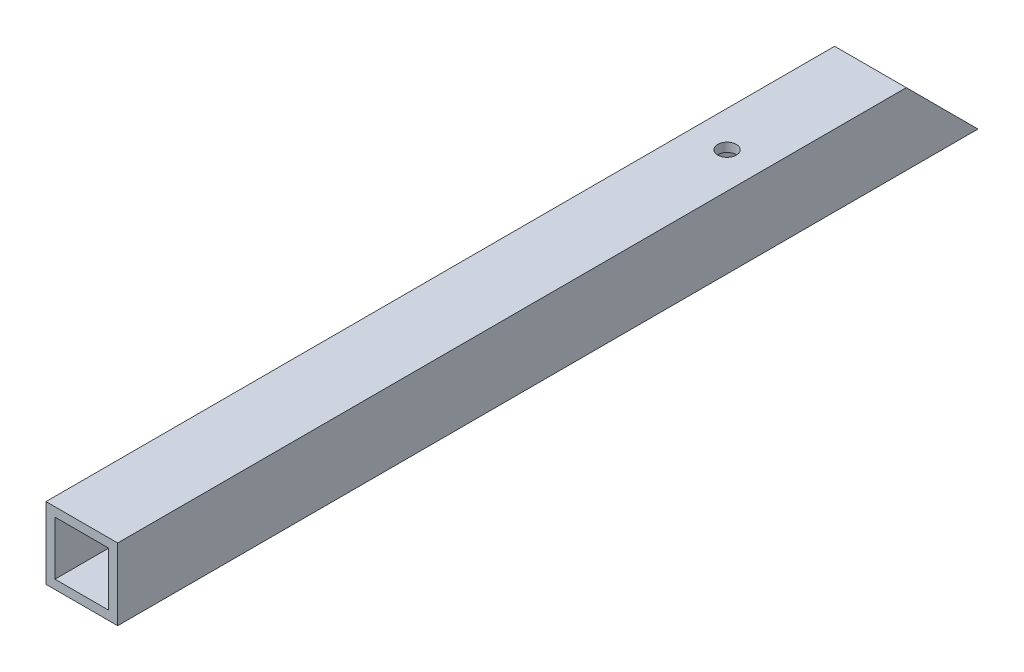
ISO-10303-21;
HEADER;
FILE_DESCRIPTION(('STEP AP214'),'2;1');
FILE_NAME('part.step','',(''),(''),'','','');
FILE_SCHEMA(('AUTOMOTIVE_DESIGN { 1 0 10303 214 1 1 1 1 }'));
ENDSEC;
DATA;
#1=APPLICATION_CONTEXT('core data for automotive mechanical design processes');
#2=APPLICATION_PROTOCOL_DEFINITION('international standard','automotive_design',2000,#1);
#3=PRODUCT_CONTEXT('',#1,'mechanical');
#4=PRODUCT('Part','Part','',(#3));
#5=PRODUCT_RELATED_PRODUCT_CATEGORY('part','',(#4));
#6=PRODUCT_DEFINITION_FORMATION('','',#4);
#7=PRODUCT_DEFINITION_CONTEXT('part definition',#1,'design');
#8=PRODUCT_DEFINITION('design','',#6,#7);
#9=PRODUCT_DEFINITION_SHAPE('','',#8);
#10=(LENGTH_UNIT() NAMED_UNIT(*) SI_UNIT(.MILLI.,.METRE.));
#11=(NAMED_UNIT(*) PLANE_ANGLE_UNIT() SI_UNIT($,.RADIAN.));
#12=(NAMED_UNIT(*) SI_UNIT($,.STERADIAN.) SOLID_ANGLE_UNIT());
#13=UNCERTAINTY_MEASURE_WITH_UNIT(LENGTH_MEASURE(1.E-05),#10,'distance_accuracy_value','');
#14=(GEOMETRIC_REPRESENTATION_CONTEXT(3) GLOBAL_UNCERTAINTY_ASSIGNED_CONTEXT((#13)) GLOBAL_UNIT_ASSIGNED_CONTEXT((#10,
#11,#12)) REPRESENTATION_CONTEXT('',''));
#15=CARTESIAN_POINT('',(0.,0.,0.));
#16=DIRECTION('',(0.,0.,1.));
#17=DIRECTION('',(1.,0.,0.));
#18=AXIS2_PLACEMENT_3D('',#15,#16,#17);
#19=CARTESIAN_POINT('',(0.,0.,304.8));
#20=DIRECTION('',(0.,0.,1.));
#21=DIRECTION('',(1.,0.,0.));
#22=AXIS2_PLACEMENT_3D('',#19,#20,#21);
#23=PLANE('',#22);
#24=DIRECTION('',(0.,-1.,0.));
#25=VECTOR('',#24,1.);
#26=CARTESIAN_POINT('',(-12.7,-12.7,304.8));
#27=LINE('',#26,#25);
#28=CARTESIAN_POINT('',(-12.7,12.7,304.8));
#29=VERTEX_POINT('',#28);
#30=CARTESIAN_POINT('',(-12.7,-12.7,304.8));
#31=VERTEX_POINT('',#30);
#32=EDGE_CURVE('E110',#29,#31,#27,.T.);
#33=ORIENTED_EDGE('',*,*,#32,.T.);
#34=DIRECTION('',(1.,0.,0.));
#35=VECTOR('',#34,1.);
#36=CARTESIAN_POINT('',(12.7,-12.7,304.8));
#37=LINE('',#36,#35);
#38=CARTESIAN_POINT('',(12.7,-12.7,304.8));
#39=VERTEX_POINT('',#38);
#40=EDGE_CURVE('E122',#31,#39,#37,.T.);
#41=ORIENTED_EDGE('',*,*,#40,.T.);
#42=DIRECTION('',(0.,1.,0.));
#43=VECTOR('',#42,1.);
#44=CARTESIAN_POINT('',(12.7,-12.7,304.8));
#45=LINE('',#44,#43);
#46=CARTESIAN_POINT('',(12.7,12.7,304.8));
#47=VERTEX_POINT('',#46);
#48=EDGE_CURVE('E134',#39,#47,#45,.T.);
#49=ORIENTED_EDGE('',*,*,#48,.T.);
#50=DIRECTION('',(-1.,0.,0.));
#51=VECTOR('',#50,1.);
#52=CARTESIAN_POINT('',(12.7,12.7,304.8));
#53=LINE('',#52,#51);
#54=EDGE_CURVE('E131',#47,#29,#53,.T.);
#55=ORIENTED_EDGE('',*,*,#54,.T.);
#56=EDGE_LOOP('',(#33,#41,#49,#55));
#57=FACE_BOUND('',#56,.T.);
#58=DIRECTION('',(-1.,0.,0.));
#59=VECTOR('',#58,1.);
#60=CARTESIAN_POINT('',(9.525,9.525,304.8));
#61=LINE('',#60,#59);
#62=CARTESIAN_POINT('',(9.525,9.525,304.8));
#63=VERTEX_POINT('',#62);
#64=CARTESIAN_POINT('',(-9.525,9.525,304.8));
#65=VERTEX_POINT('',#64);
#66=EDGE_CURVE('E154',#63,#65,#61,.T.);
#67=ORIENTED_EDGE('',*,*,#66,.F.);
#68=DIRECTION('',(0.,1.,0.));
#69=VECTOR('',#68,1.);
#70=CARTESIAN_POINT('',(9.525,-9.525,304.8));
#71=LINE('',#70,#69);
#72=CARTESIAN_POINT('',(9.525,-9.525,304.8));
#73=VERTEX_POINT('',#72);
#74=EDGE_CURVE('E156',#73,#63,#71,.T.);
#75=ORIENTED_EDGE('',*,*,#74,.F.);
#76=DIRECTION('',(1.,0.,0.));
#77=VECTOR('',#76,1.);
#78=CARTESIAN_POINT('',(9.525,-9.525,304.8));
#79=LINE('',#78,#77);
#80=CARTESIAN_POINT('',(-9.525,-9.525,304.8));
#81=VERTEX_POINT('',#80);
#82=EDGE_CURVE('E149',#81,#73,#79,.T.);
#83=ORIENTED_EDGE('',*,*,#82,.F.);
#84=DIRECTION('',(0.,-1.,0.));
#85=VECTOR('',#84,1.);
#86=CARTESIAN_POINT('',(-9.525,-9.525,304.8));
#87=LINE('',#86,#85);
#88=EDGE_CURVE('E151',#65,#81,#87,.T.);
#89=ORIENTED_EDGE('',*,*,#88,.F.);
#90=EDGE_LOOP('',(#67,#75,#83,#89));
#91=FACE_BOUND('',#90,.T.);
#92=ADVANCED_FACE('F39',(#57,#91),#23,.T.);
#93=CARTESIAN_POINT('',(-12.7,-12.7,304.8));
#94=DIRECTION('',(1.,0.,0.));
#95=DIRECTION('',(0.,0.,-1.));
#96=AXIS2_PLACEMENT_3D('',#93,#94,#95);
#97=PLANE('',#96);
#98=DIRECTION('',(0.,0.,-1.));
#99=VECTOR('',#98,1.);
#100=CARTESIAN_POINT('',(-12.7,12.7,304.8));
#101=LINE('',#100,#99);
#102=CARTESIAN_POINT('',(-12.7,12.7,25.4000000000004));
#103=VERTEX_POINT('',#102);
#104=EDGE_CURVE('E118',#29,#103,#101,.T.);
#105=ORIENTED_EDGE('',*,*,#104,.T.);
#106=DIRECTION('',(0.,-0.707106781186544,-0.707106781186551));
#107=VECTOR('',#106,1.);
#108=CARTESIAN_POINT('',(-12.7,-12.7,0.));
#109=LINE('',#108,#107);
#110=CARTESIAN_POINT('',(-12.7,-12.7,0.));
#111=VERTEX_POINT('',#110);
#112=EDGE_CURVE('E55',#103,#111,#109,.T.);
#113=ORIENTED_EDGE('',*,*,#112,.T.);
#114=DIRECTION('',(0.,0.,-1.));
#115=VECTOR('',#114,1.);
#116=CARTESIAN_POINT('',(-12.7,-12.7,304.8));
#117=LINE('',#116,#115);
#118=EDGE_CURVE('E48',#31,#111,#117,.T.);
#119=ORIENTED_EDGE('',*,*,#118,.F.);
#120=ORIENTED_EDGE('',*,*,#32,.F.);
#121=EDGE_LOOP('',(#105,#113,#119,#120));
#122=FACE_BOUND('',#121,.T.);
#123=ADVANCED_FACE('F41',(#122),#97,.F.);
#124=CARTESIAN_POINT('',(12.7,-12.7,304.8));
#125=DIRECTION('',(0.,1.,0.));
#126=DIRECTION('',(-1.,0.,0.));
#127=AXIS2_PLACEMENT_3D('',#124,#125,#126);
#128=PLANE('',#127);
#129=CARTESIAN_POINT('',(0.,-12.7,76.2000000000004));
#130=DIRECTION('',(0.,1.,0.));
#131=DIRECTION('',(-1.,0.,0.));
#132=AXIS2_PLACEMENT_3D('',#129,#130,#131);
#133=CIRCLE('',#132,3.302);
#134=CARTESIAN_POINT('',(-3.302,-12.7,76.2000000000004));
#135=VERTEX_POINT('',#134);
#136=EDGE_CURVE('E171',#135,#135,#133,.T.);
#137=ORIENTED_EDGE('',*,*,#136,.T.);
#138=EDGE_LOOP('',(#137));
#139=FACE_BOUND('',#138,.T.);
#140=DIRECTION('',(1.,0.,0.));
#141=VECTOR('',#140,1.);
#142=CARTESIAN_POINT('',(12.7,-12.7,0.));
#143=LINE('',#142,#141);
#144=CARTESIAN_POINT('',(12.7,-12.7,0.));
#145=VERTEX_POINT('',#144);
#146=EDGE_CURVE('E102',#111,#145,#143,.T.);
#147=ORIENTED_EDGE('',*,*,#146,.T.);
#148=DIRECTION('',(0.,0.,-1.));
#149=VECTOR('',#148,1.);
#150=CARTESIAN_POINT('',(12.7,-12.7,304.8));
#151=LINE('',#150,#149);
#152=EDGE_CURVE('E124',#39,#145,#151,.T.);
#153=ORIENTED_EDGE('',*,*,#152,.F.);
#154=ORIENTED_EDGE('',*,*,#40,.F.);
#155=ORIENTED_EDGE('',*,*,#118,.T.);
#156=EDGE_LOOP('',(#147,#153,#154,#155));
#157=FACE_BOUND('',#156,.T.);
#158=ADVANCED_FACE('F121',(#139,#157),#128,.F.);
#159=CARTESIAN_POINT('',(12.7,-12.7,304.8));
#160=DIRECTION('',(-1.,0.,0.));
#161=DIRECTION('',(0.,0.,1.));
#162=AXIS2_PLACEMENT_3D('',#159,#160,#161);
#163=PLANE('',#162);
#164=ORIENTED_EDGE('',*,*,#152,.T.);
#165=DIRECTION('',(0.,-0.707106781186544,-0.707106781186551));
#166=VECTOR('',#165,1.);
#167=CARTESIAN_POINT('',(12.7,-12.7,0.));
#168=LINE('',#167,#166);
#169=CARTESIAN_POINT('',(12.7,12.7,25.4000000000003));
#170=VERTEX_POINT('',#169);
#171=EDGE_CURVE('E105',#170,#145,#168,.T.);
#172=ORIENTED_EDGE('',*,*,#171,.F.);
#173=DIRECTION('',(0.,0.,-1.));
#174=VECTOR('',#173,1.);
#175=CARTESIAN_POINT('',(12.7,12.7,304.8));
#176=LINE('',#175,#174);
#177=EDGE_CURVE('E126',#47,#170,#176,.T.);
#178=ORIENTED_EDGE('',*,*,#177,.F.);
#179=ORIENTED_EDGE('',*,*,#48,.F.);
#180=EDGE_LOOP('',(#164,#172,#178,#179));
#181=FACE_BOUND('',#180,.T.);
#182=ADVANCED_FACE('F221',(#181),#163,.F.);
#183=CARTESIAN_POINT('',(12.7,12.7,304.8));
#184=DIRECTION('',(0.,-1.,0.));
#185=DIRECTION('',(1.,0.,0.));
#186=AXIS2_PLACEMENT_3D('',#183,#184,#185);
#187=PLANE('',#186);
#188=CARTESIAN_POINT('',(0.,12.7,76.2000000000004));
#189=DIRECTION('',(0.,1.,0.));
#190=DIRECTION('',(-1.,0.,0.));
#191=AXIS2_PLACEMENT_3D('',#188,#189,#190);
#192=CIRCLE('',#191,3.302);
#193=CARTESIAN_POINT('',(-3.302,12.7,76.2000000000004));
#194=VERTEX_POINT('',#193);
#195=EDGE_CURVE('E168',#194,#194,#192,.T.);
#196=ORIENTED_EDGE('',*,*,#195,.F.);
#197=EDGE_LOOP('',(#196));
#198=FACE_BOUND('',#197,.T.);
#199=ORIENTED_EDGE('',*,*,#177,.T.);
#200=DIRECTION('',(1.,0.,0.));
#201=VECTOR('',#200,1.);
#202=CARTESIAN_POINT('',(-12.7,12.7,25.4000000000003));
#203=LINE('',#202,#201);
#204=EDGE_CURVE('E119',#103,#170,#203,.T.);
#205=ORIENTED_EDGE('',*,*,#204,.F.);
#206=ORIENTED_EDGE('',*,*,#104,.F.);
#207=ORIENTED_EDGE('',*,*,#54,.F.);
#208=EDGE_LOOP('',(#199,#205,#206,#207));
#209=FACE_BOUND('',#208,.T.);
#210=ADVANCED_FACE('F210',(#198,#209),#187,.F.);
#211=CARTESIAN_POINT('',(9.525,-9.525,304.8));
#212=DIRECTION('',(-1.,0.,0.));
#213=DIRECTION('',(0.,0.,1.));
#214=AXIS2_PLACEMENT_3D('',#211,#212,#213);
#215=PLANE('',#214);
#216=DIRECTION('',(0.,0.707106781186544,0.707106781186551));
#217=VECTOR('',#216,1.);
#218=CARTESIAN_POINT('',(9.525,141.2875,153.987500000002));
#219=LINE('',#218,#217);
#220=CARTESIAN_POINT('',(9.525,-9.525,3.17500000000004));
#221=VERTEX_POINT('',#220);
#222=CARTESIAN_POINT('',(9.525,9.525,22.2250000000002));
#223=VERTEX_POINT('',#222);
#224=EDGE_CURVE('E158',#221,#223,#219,.T.);
#225=ORIENTED_EDGE('',*,*,#224,.F.);
#226=DIRECTION('',(0.,0.,-1.));
#227=VECTOR('',#226,1.);
#228=CARTESIAN_POINT('',(9.525,-9.525,304.8));
#229=LINE('',#228,#227);
#230=EDGE_CURVE('E146',#73,#221,#229,.T.);
#231=ORIENTED_EDGE('',*,*,#230,.F.);
#232=ORIENTED_EDGE('',*,*,#74,.T.);
#233=DIRECTION('',(0.,0.,-1.));
#234=VECTOR('',#233,1.);
#235=CARTESIAN_POINT('',(9.525,9.525,304.8));
#236=LINE('',#235,#234);
#237=EDGE_CURVE('E111',#63,#223,#236,.T.);
#238=ORIENTED_EDGE('',*,*,#237,.T.);
#239=EDGE_LOOP('',(#225,#231,#232,#238));
#240=FACE_BOUND('',#239,.T.);
#241=ADVANCED_FACE('F196',(#240),#215,.T.);
#242=CARTESIAN_POINT('',(9.525,9.525,304.8));
#243=DIRECTION('',(0.,-1.,0.));
#244=DIRECTION('',(1.,0.,0.));
#245=AXIS2_PLACEMENT_3D('',#242,#243,#244);
#246=PLANE('',#245);
#247=CARTESIAN_POINT('',(0.,9.525,76.2000000000004));
#248=DIRECTION('',(0.,-1.,0.));
#249=DIRECTION('',(1.,0.,0.));
#250=AXIS2_PLACEMENT_3D('',#247,#248,#249);
#251=CIRCLE('',#250,3.302);
#252=CARTESIAN_POINT('',(-3.302,9.525,76.2000000000004));
#253=VERTEX_POINT('',#252);
#254=EDGE_CURVE('E164',#253,#253,#251,.T.);
#255=ORIENTED_EDGE('',*,*,#254,.F.);
#256=EDGE_LOOP('',(#255));
#257=FACE_BOUND('',#256,.T.);
#258=DIRECTION('',(-1.,0.,0.));
#259=VECTOR('',#258,1.);
#260=CARTESIAN_POINT('',(9.52500000000005,9.525,22.2250000000002));
#261=LINE('',#260,#259);
#262=CARTESIAN_POINT('',(-9.525,9.52500000000001,22.2250000000002));
#263=VERTEX_POINT('',#262);
#264=EDGE_CURVE('E160',#223,#263,#261,.T.);
#265=ORIENTED_EDGE('',*,*,#264,.F.);
#266=ORIENTED_EDGE('',*,*,#237,.F.);
#267=ORIENTED_EDGE('',*,*,#66,.T.);
#268=DIRECTION('',(0.,0.,-1.));
#269=VECTOR('',#268,1.);
#270=CARTESIAN_POINT('',(-9.525,9.525,304.8));
#271=LINE('',#270,#269);
#272=EDGE_CURVE('E140',#65,#263,#271,.T.);
#273=ORIENTED_EDGE('',*,*,#272,.T.);
#274=EDGE_LOOP('',(#265,#266,#267,#273));
#275=FACE_BOUND('',#274,.T.);
#276=ADVANCED_FACE('F200',(#257,#275),#246,.T.);
#277=CARTESIAN_POINT('',(-9.525,-9.525,304.8));
#278=DIRECTION('',(1.,0.,0.));
#279=DIRECTION('',(0.,0.,-1.));
#280=AXIS2_PLACEMENT_3D('',#277,#278,#279);
#281=PLANE('',#280);
#282=DIRECTION('',(0.,-0.707106781186544,-0.707106781186551));
#283=VECTOR('',#282,1.);
#284=CARTESIAN_POINT('',(-9.525,141.2875,153.987500000002));
#285=LINE('',#284,#283);
#286=CARTESIAN_POINT('',(-9.525,-9.525,3.17500000000015));
#287=VERTEX_POINT('',#286);
#288=EDGE_CURVE('E62',#263,#287,#285,.T.);
#289=ORIENTED_EDGE('',*,*,#288,.F.);
#290=ORIENTED_EDGE('',*,*,#272,.F.);
#291=ORIENTED_EDGE('',*,*,#88,.T.);
#292=DIRECTION('',(0.,0.,-1.));
#293=VECTOR('',#292,1.);
#294=CARTESIAN_POINT('',(-9.525,-9.525,304.8));
#295=LINE('',#294,#293);
#296=EDGE_CURVE('E143',#81,#287,#295,.T.);
#297=ORIENTED_EDGE('',*,*,#296,.T.);
#298=EDGE_LOOP('',(#289,#290,#291,#297));
#299=FACE_BOUND('',#298,.T.);
#300=ADVANCED_FACE('F184',(#299),#281,.T.);
#301=CARTESIAN_POINT('',(9.525,-9.525,304.8));
#302=DIRECTION('',(0.,1.,0.));
#303=DIRECTION('',(-1.,0.,0.));
#304=AXIS2_PLACEMENT_3D('',#301,#302,#303);
#305=PLANE('',#304);
#306=CARTESIAN_POINT('',(0.,-9.525,76.2000000000004));
#307=DIRECTION('',(0.,1.,0.));
#308=DIRECTION('',(-1.,0.,0.));
#309=AXIS2_PLACEMENT_3D('',#306,#307,#308);
#310=CIRCLE('',#309,3.302);
#311=CARTESIAN_POINT('',(-3.302,-9.525,76.2000000000004));
#312=VERTEX_POINT('',#311);
#313=EDGE_CURVE('E43',#312,#312,#310,.T.);
#314=ORIENTED_EDGE('',*,*,#313,.F.);
#315=EDGE_LOOP('',(#314));
#316=FACE_BOUND('',#315,.T.);
#317=DIRECTION('',(1.,0.,0.));
#318=VECTOR('',#317,1.);
#319=CARTESIAN_POINT('',(9.52500000000005,-9.525,3.17500000000004));
#320=LINE('',#319,#318);
#321=EDGE_CURVE('E11',#287,#221,#320,.T.);
#322=ORIENTED_EDGE('',*,*,#321,.F.);
#323=ORIENTED_EDGE('',*,*,#296,.F.);
#324=ORIENTED_EDGE('',*,*,#82,.T.);
#325=ORIENTED_EDGE('',*,*,#230,.T.);
#326=EDGE_LOOP('',(#322,#323,#324,#325));
#327=FACE_BOUND('',#326,.T.);
#328=ADVANCED_FACE('F181',(#316,#327),#305,.T.);
#329=CARTESIAN_POINT('',(-12.7,-12.7,0.));
#330=DIRECTION('',(0.,-0.707106781186551,0.707106781186544));
#331=DIRECTION('',(0.,-0.707106781186544,-0.707106781186551));
#332=AXIS2_PLACEMENT_3D('',#329,#330,#331);
#333=PLANE('',#332);
#334=ORIENTED_EDGE('',*,*,#224,.T.);
#335=ORIENTED_EDGE('',*,*,#264,.T.);
#336=ORIENTED_EDGE('',*,*,#288,.T.);
#337=ORIENTED_EDGE('',*,*,#321,.T.);
#338=EDGE_LOOP('',(#334,#335,#336,#337));
#339=FACE_BOUND('',#338,.T.);
#340=ORIENTED_EDGE('',*,*,#171,.T.);
#341=ORIENTED_EDGE('',*,*,#146,.F.);
#342=ORIENTED_EDGE('',*,*,#112,.F.);
#343=ORIENTED_EDGE('',*,*,#204,.T.);
#344=EDGE_LOOP('',(#340,#341,#342,#343));
#345=FACE_BOUND('',#344,.T.);
#346=ADVANCED_FACE('F103',(#339,#345),#333,.F.);
#347=CARTESIAN_POINT('',(0.,-12.7,76.2000000000004));
#348=DIRECTION('',(0.,1.,0.));
#349=DIRECTION('',(-1.,0.,0.));
#350=AXIS2_PLACEMENT_3D('',#347,#348,#349);
#351=CYLINDRICAL_SURFACE('',#350,3.302);
#352=CARTESIAN_POINT('',(-3.302,-9.525,76.2000000000004));
#353=CARTESIAN_POINT('',(-3.302,-9.55807291666666,76.2000000000004));
#354=CARTESIAN_POINT('',(-3.302,-9.59114583333333,76.2000000000004));
#355=CARTESIAN_POINT('',(-3.302,-9.65729166666666,76.2000000000004));
#356=CARTESIAN_POINT('',(-3.302,-9.69036458333333,76.2000000000004));
#357=CARTESIAN_POINT('',(-3.302,-9.75651041666666,76.2000000000004));
#358=CARTESIAN_POINT('',(-3.302,-9.78958333333333,76.2000000000004));
#359=CARTESIAN_POINT('',(-3.302,-9.85572916666666,76.2000000000004));
#360=CARTESIAN_POINT('',(-3.302,-9.88880208333333,76.2000000000004));
#361=CARTESIAN_POINT('',(-3.302,-9.95494791666667,76.2000000000004));
#362=CARTESIAN_POINT('',(-3.302,-9.98802083333333,76.2000000000004));
#363=CARTESIAN_POINT('',(-3.302,-10.0541666666667,76.2000000000004));
#364=CARTESIAN_POINT('',(-3.302,-10.0872395833333,76.2000000000004));
#365=CARTESIAN_POINT('',(-3.302,-10.1533854166667,76.2000000000004));
#366=CARTESIAN_POINT('',(-3.302,-10.1864583333333,76.2000000000004));
#367=CARTESIAN_POINT('',(-3.302,-10.2526041666667,76.2000000000004));
#368=CARTESIAN_POINT('',(-3.302,-10.2856770833333,76.2000000000004));
#369=CARTESIAN_POINT('',(-3.302,-10.3518229166667,76.2000000000004));
#370=CARTESIAN_POINT('',(-3.302,-10.3848958333333,76.2000000000004));
#371=CARTESIAN_POINT('',(-3.302,-10.4510416666667,76.2000000000004));
#372=CARTESIAN_POINT('',(-3.302,-10.4841145833333,76.2000000000004));
#373=CARTESIAN_POINT('',(-3.302,-10.5502604166667,76.2000000000004));
#374=CARTESIAN_POINT('',(-3.302,-10.5833333333333,76.2000000000004));
#375=CARTESIAN_POINT('',(-3.302,-10.6494791666667,76.2000000000004));
#376=CARTESIAN_POINT('',(-3.302,-10.6825520833333,76.2000000000004));
#377=CARTESIAN_POINT('',(-3.302,-10.7486979166667,76.2000000000004));
#378=CARTESIAN_POINT('',(-3.302,-10.7817708333333,76.2000000000004));
#379=CARTESIAN_POINT('',(-3.302,-10.8479166666667,76.2000000000004));
#380=CARTESIAN_POINT('',(-3.302,-10.8809895833333,76.2000000000004));
#381=CARTESIAN_POINT('',(-3.302,-10.9471354166667,76.2000000000004));
#382=CARTESIAN_POINT('',(-3.302,-10.9802083333333,76.2000000000004));
#383=CARTESIAN_POINT('',(-3.302,-11.0463541666667,76.2000000000004));
#384=CARTESIAN_POINT('',(-3.302,-11.0794270833333,76.2000000000004));
#385=CARTESIAN_POINT('',(-3.302,-11.1455729166667,76.2000000000004));
#386=CARTESIAN_POINT('',(-3.302,-11.1786458333333,76.2000000000004));
#387=CARTESIAN_POINT('',(-3.302,-11.2447916666667,76.2000000000004));
#388=CARTESIAN_POINT('',(-3.302,-11.2778645833333,76.2000000000004));
#389=CARTESIAN_POINT('',(-3.302,-11.3440104166667,76.2000000000004));
#390=CARTESIAN_POINT('',(-3.302,-11.3770833333333,76.2000000000004));
#391=CARTESIAN_POINT('',(-3.302,-11.4432291666667,76.2000000000004));
#392=CARTESIAN_POINT('',(-3.302,-11.4763020833333,76.2000000000004));
#393=CARTESIAN_POINT('',(-3.302,-11.5424479166667,76.2000000000004));
#394=CARTESIAN_POINT('',(-3.302,-11.5755208333333,76.2000000000004));
#395=CARTESIAN_POINT('',(-3.302,-11.6416666666667,76.2000000000004));
#396=CARTESIAN_POINT('',(-3.302,-11.6747395833333,76.2000000000004));
#397=CARTESIAN_POINT('',(-3.302,-11.7408854166667,76.2000000000004));
#398=CARTESIAN_POINT('',(-3.302,-11.7739583333333,76.2000000000004));
#399=CARTESIAN_POINT('',(-3.302,-11.8401041666667,76.2000000000004));
#400=CARTESIAN_POINT('',(-3.302,-11.8731770833333,76.2000000000004));
#401=CARTESIAN_POINT('',(-3.302,-11.9393229166667,76.2000000000004));
#402=CARTESIAN_POINT('',(-3.302,-11.9723958333333,76.2000000000004));
#403=CARTESIAN_POINT('',(-3.302,-12.0385416666667,76.2000000000004));
#404=CARTESIAN_POINT('',(-3.302,-12.0716145833333,76.2000000000004));
#405=CARTESIAN_POINT('',(-3.302,-12.1377604166667,76.2000000000004));
#406=CARTESIAN_POINT('',(-3.302,-12.1708333333333,76.2000000000004));
#407=CARTESIAN_POINT('',(-3.302,-12.2369791666667,76.2000000000004));
#408=CARTESIAN_POINT('',(-3.302,-12.2700520833333,76.2000000000004));
#409=CARTESIAN_POINT('',(-3.302,-12.3361979166667,76.2000000000004));
#410=CARTESIAN_POINT('',(-3.302,-12.3692708333333,76.2000000000004));
#411=CARTESIAN_POINT('',(-3.302,-12.4354166666667,76.2000000000004));
#412=CARTESIAN_POINT('',(-3.302,-12.4684895833333,76.2000000000004));
#413=CARTESIAN_POINT('',(-3.302,-12.5346354166667,76.2000000000004));
#414=CARTESIAN_POINT('',(-3.302,-12.5677083333333,76.2000000000004));
#415=CARTESIAN_POINT('',(-3.302,-12.6338541666667,76.2000000000004));
#416=CARTESIAN_POINT('',(-3.302,-12.6669270833333,76.2000000000004));
#417=CARTESIAN_POINT('',(-3.302,-12.7,76.2000000000004));
#418=B_SPLINE_CURVE_WITH_KNOTS('',3,(#352,#353,#354,#355,#356,#357,#358,#359,#360,#361,#362,
#363,#364,#365,#366,#367,#368,#369,#370,#371,#372,#373,#374,#375,#376,#377,#378,#379,#380,#381,
#382,#383,#384,#385,#386,#387,#388,#389,#390,#391,#392,#393,#394,#395,#396,#397,#398,#399,#400,
#401,#402,#403,#404,#405,#406,#407,#408,#409,#410,#411,#412,#413,#414,#415,#416,#417),
.UNSPECIFIED.,.F.,.F.,(4,2,2,2,2,2,2,2,2,2,2,2,2,2,2,2,2,2,2,2,2,2,2,2,2,2,2,2,2,2,2,2,4),(0.,
0.0992187500000012,0.198437500000001,0.297656250000002,0.396875000000001,0.496093750000001,
0.595312500000002,0.694531250000002,0.793750000000001,0.892968750000002,0.992187500000002,
1.09140625,1.190625,1.28984375,1.3890625,1.48828125,1.5875,1.68671875,1.7859375,1.88515625,
1.984375,2.08359375,2.1828125,2.28203125,2.38125,2.48046875,2.5796875,2.67890625000001,2.778125,
2.87734375,2.97656250000001,3.07578125,3.175),.UNSPECIFIED.);
#419=EDGE_CURVE('BSEAM178',#312,#135,#418,.T.);
#420=ORIENTED_EDGE('',*,*,#313,.T.);
#421=ORIENTED_EDGE('',*,*,#136,.F.);
#422=ORIENTED_EDGE('',*,*,#419,.T.);
#423=ORIENTED_EDGE('',*,*,#419,.F.);
#424=EDGE_LOOP('',(#420,#422,#421,#423));
#425=FACE_BOUND('',#424,.T.);
#426=ADVANCED_FACE('F178',(#425),#351,.F.);
#427=CARTESIAN_POINT('',(-3.302,9.525,76.2000000000004));
#428=CARTESIAN_POINT('',(-3.302,9.55807291666666,76.2000000000004));
#429=CARTESIAN_POINT('',(-3.302,9.59114583333333,76.2000000000004));
#430=CARTESIAN_POINT('',(-3.302,9.65729166666666,76.2000000000004));
#431=CARTESIAN_POINT('',(-3.302,9.69036458333333,76.2000000000004));
#432=CARTESIAN_POINT('',(-3.302,9.75651041666666,76.2000000000004));
#433=CARTESIAN_POINT('',(-3.302,9.78958333333333,76.2000000000004));
#434=CARTESIAN_POINT('',(-3.302,9.85572916666666,76.2000000000004));
#435=CARTESIAN_POINT('',(-3.302,9.88880208333333,76.2000000000004));
#436=CARTESIAN_POINT('',(-3.302,9.95494791666667,76.2000000000004));
#437=CARTESIAN_POINT('',(-3.302,9.98802083333333,76.2000000000004));
#438=CARTESIAN_POINT('',(-3.302,10.0541666666667,76.2000000000004));
#439=CARTESIAN_POINT('',(-3.302,10.0872395833333,76.2000000000004));
#440=CARTESIAN_POINT('',(-3.302,10.1533854166667,76.2000000000004));
#441=CARTESIAN_POINT('',(-3.302,10.1864583333333,76.2000000000004));
#442=CARTESIAN_POINT('',(-3.302,10.2526041666667,76.2000000000004));
#443=CARTESIAN_POINT('',(-3.302,10.2856770833333,76.2000000000004));
#444=CARTESIAN_POINT('',(-3.302,10.3518229166667,76.2000000000004));
#445=CARTESIAN_POINT('',(-3.302,10.3848958333333,76.2000000000004));
#446=CARTESIAN_POINT('',(-3.302,10.4510416666667,76.2000000000004));
#447=CARTESIAN_POINT('',(-3.302,10.4841145833333,76.2000000000004));
#448=CARTESIAN_POINT('',(-3.302,10.5502604166667,76.2000000000004));
#449=CARTESIAN_POINT('',(-3.302,10.5833333333333,76.2000000000004));
#450=CARTESIAN_POINT('',(-3.302,10.6494791666667,76.2000000000004));
#451=CARTESIAN_POINT('',(-3.302,10.6825520833333,76.2000000000004));
#452=CARTESIAN_POINT('',(-3.302,10.7486979166667,76.2000000000004));
#453=CARTESIAN_POINT('',(-3.302,10.7817708333333,76.2000000000004));
#454=CARTESIAN_POINT('',(-3.302,10.8479166666667,76.2000000000004));
#455=CARTESIAN_POINT('',(-3.302,10.8809895833333,76.2000000000004));
#456=CARTESIAN_POINT('',(-3.302,10.9471354166667,76.2000000000004));
#457=CARTESIAN_POINT('',(-3.302,10.9802083333333,76.2000000000004));
#458=CARTESIAN_POINT('',(-3.302,11.0463541666667,76.2000000000004));
#459=CARTESIAN_POINT('',(-3.302,11.0794270833333,76.2000000000004));
#460=CARTESIAN_POINT('',(-3.302,11.1455729166667,76.2000000000004));
#461=CARTESIAN_POINT('',(-3.302,11.1786458333333,76.2000000000004));
#462=CARTESIAN_POINT('',(-3.302,11.2447916666667,76.2000000000004));
#463=CARTESIAN_POINT('',(-3.302,11.2778645833333,76.2000000000004));
#464=CARTESIAN_POINT('',(-3.302,11.3440104166667,76.2000000000004));
#465=CARTESIAN_POINT('',(-3.302,11.3770833333333,76.2000000000004));
#466=CARTESIAN_POINT('',(-3.302,11.4432291666667,76.2000000000004));
#467=CARTESIAN_POINT('',(-3.302,11.4763020833333,76.2000000000004));
#468=CARTESIAN_POINT('',(-3.302,11.5424479166667,76.2000000000004));
#469=CARTESIAN_POINT('',(-3.302,11.5755208333333,76.2000000000004));
#470=CARTESIAN_POINT('',(-3.302,11.6416666666667,76.2000000000004));
#471=CARTESIAN_POINT('',(-3.302,11.6747395833333,76.2000000000004));
#472=CARTESIAN_POINT('',(-3.302,11.7408854166667,76.2000000000004));
#473=CARTESIAN_POINT('',(-3.302,11.7739583333333,76.2000000000004));
#474=CARTESIAN_POINT('',(-3.302,11.8401041666667,76.2000000000004));
#475=CARTESIAN_POINT('',(-3.302,11.8731770833333,76.2000000000004));
#476=CARTESIAN_POINT('',(-3.302,11.9393229166667,76.2000000000004));
#477=CARTESIAN_POINT('',(-3.302,11.9723958333333,76.2000000000004));
#478=CARTESIAN_POINT('',(-3.302,12.0385416666667,76.2000000000004));
#479=CARTESIAN_POINT('',(-3.302,12.0716145833333,76.2000000000004));
#480=CARTESIAN_POINT('',(-3.302,12.1377604166667,76.2000000000004));
#481=CARTESIAN_POINT('',(-3.302,12.1708333333333,76.2000000000004));
#482=CARTESIAN_POINT('',(-3.302,12.2369791666667,76.2000000000004));
#483=CARTESIAN_POINT('',(-3.302,12.2700520833333,76.2000000000004));
#484=CARTESIAN_POINT('',(-3.302,12.3361979166667,76.2000000000004));
#485=CARTESIAN_POINT('',(-3.302,12.3692708333333,76.2000000000004));
#486=CARTESIAN_POINT('',(-3.302,12.4354166666667,76.2000000000004));
#487=CARTESIAN_POINT('',(-3.302,12.4684895833333,76.2000000000004));
#488=CARTESIAN_POINT('',(-3.302,12.5346354166667,76.2000000000004));
#489=CARTESIAN_POINT('',(-3.302,12.5677083333333,76.2000000000004));
#490=CARTESIAN_POINT('',(-3.302,12.6338541666667,76.2000000000004));
#491=CARTESIAN_POINT('',(-3.302,12.6669270833333,76.2000000000004));
#492=CARTESIAN_POINT('',(-3.302,12.7,76.2000000000004));
#493=B_SPLINE_CURVE_WITH_KNOTS('',3,(#427,#428,#429,#430,#431,#432,#433,#434,#435,#436,#437,
#438,#439,#440,#441,#442,#443,#444,#445,#446,#447,#448,#449,#450,#451,#452,#453,#454,#455,#456,
#457,#458,#459,#460,#461,#462,#463,#464,#465,#466,#467,#468,#469,#470,#471,#472,#473,#474,#475,
#476,#477,#478,#479,#480,#481,#482,#483,#484,#485,#486,#487,#488,#489,#490,#491,#492),
.UNSPECIFIED.,.F.,.F.,(4,2,2,2,2,2,2,2,2,2,2,2,2,2,2,2,2,2,2,2,2,2,2,2,2,2,2,2,2,2,2,2,4),(0.,
0.0992187500000012,0.198437499999999,0.29765625,0.396875000000001,0.496093749999999,0.5953125,
0.694531250000002,0.793750000000003,0.892968750000001,0.992187500000002,1.09140625,1.190625,
1.28984375,1.3890625,1.48828125,1.5875,1.68671875,1.7859375,1.88515625,1.984375,2.08359375,
2.1828125,2.28203125,2.38125,2.48046875,2.5796875,2.67890625,2.778125,2.87734375,
2.97656250000001,3.07578125,3.175),.UNSPECIFIED.);
#494=EDGE_CURVE('BSEAM269',#253,#194,#493,.T.);
#495=ORIENTED_EDGE('',*,*,#254,.T.);
#496=ORIENTED_EDGE('',*,*,#195,.T.);
#497=ORIENTED_EDGE('',*,*,#494,.T.);
#498=ORIENTED_EDGE('',*,*,#494,.F.);
#499=EDGE_LOOP('',(#495,#497,#496,#498));
#500=FACE_BOUND('',#499,.T.);
#501=ADVANCED_FACE('F269',(#500),#351,.F.);
#502=CLOSED_SHELL('',(#92,#123,#158,#182,#210,#241,#276,#300,#328,#346,#426,#501));
#503=MANIFOLD_SOLID_BREP('B2',#502);
#504=ADVANCED_BREP_SHAPE_REPRESENTATION('',(#18,#503),#14);
#505=SHAPE_DEFINITION_REPRESENTATION(#9,#504);
ENDSEC;
END-ISO-10303-21;
